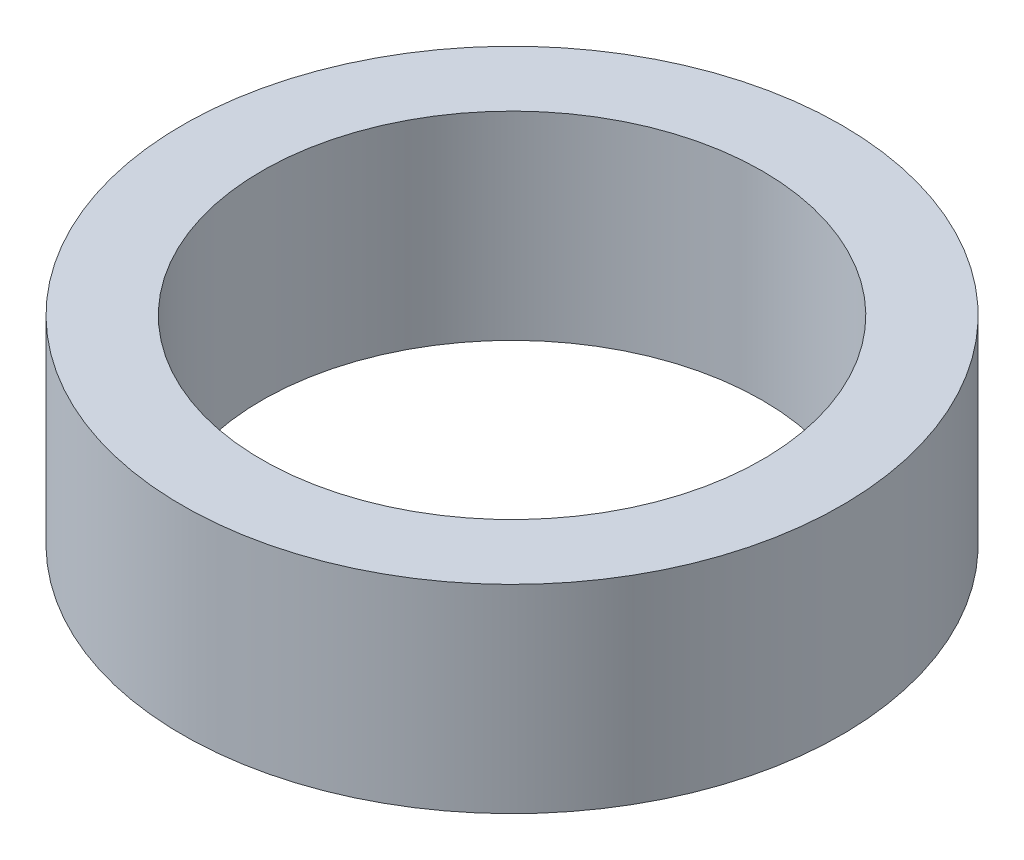
ISO-10303-21;
HEADER;
FILE_DESCRIPTION(('STEP AP214'),'2;1');
FILE_NAME('part.step','',(''),(''),'','','');
FILE_SCHEMA(('AUTOMOTIVE_DESIGN { 1 0 10303 214 1 1 1 1 }'));
ENDSEC;
DATA;
#1=APPLICATION_CONTEXT('core data for automotive mechanical design processes');
#2=APPLICATION_PROTOCOL_DEFINITION('international standard','automotive_design',2000,#1);
#3=PRODUCT_CONTEXT('',#1,'mechanical');
#4=PRODUCT('Part','Part','',(#3));
#5=PRODUCT_RELATED_PRODUCT_CATEGORY('part','',(#4));
#6=PRODUCT_DEFINITION_FORMATION('','',#4);
#7=PRODUCT_DEFINITION_CONTEXT('part definition',#1,'design');
#8=PRODUCT_DEFINITION('design','',#6,#7);
#9=PRODUCT_DEFINITION_SHAPE('','',#8);
#10=(LENGTH_UNIT() NAMED_UNIT(*) SI_UNIT(.MILLI.,.METRE.));
#11=(NAMED_UNIT(*) PLANE_ANGLE_UNIT() SI_UNIT($,.RADIAN.));
#12=(NAMED_UNIT(*) SI_UNIT($,.STERADIAN.) SOLID_ANGLE_UNIT());
#13=UNCERTAINTY_MEASURE_WITH_UNIT(LENGTH_MEASURE(1.E-05),#10,'distance_accuracy_value','');
#14=(GEOMETRIC_REPRESENTATION_CONTEXT(3) GLOBAL_UNCERTAINTY_ASSIGNED_CONTEXT((#13)) GLOBAL_UNIT_ASSIGNED_CONTEXT((#10,
#11,#12)) REPRESENTATION_CONTEXT('',''));
#15=CARTESIAN_POINT('',(0.,0.,0.));
#16=DIRECTION('',(0.,0.,1.));
#17=DIRECTION('',(1.,0.,0.));
#18=AXIS2_PLACEMENT_3D('',#15,#16,#17);
#19=CARTESIAN_POINT('',(0.,3.175,0.));
#20=DIRECTION('',(0.,1.,0.));
#21=DIRECTION('',(0.,0.,-1.));
#22=AXIS2_PLACEMENT_3D('',#19,#20,#21);
#23=PLANE('',#22);
#24=CARTESIAN_POINT('',(0.,3.175,0.));
#25=DIRECTION('',(0.,-1.,0.));
#26=DIRECTION('',(0.,0.,-1.));
#27=AXIS2_PLACEMENT_3D('',#24,#25,#26);
#28=CIRCLE('',#27,5.27);
#29=CARTESIAN_POINT('',(0.,3.175,-5.27));
#30=VERTEX_POINT('',#29);
#31=EDGE_CURVE('E10',#30,#30,#28,.T.);
#32=ORIENTED_EDGE('',*,*,#31,.F.);
#33=EDGE_LOOP('',(#32));
#34=FACE_BOUND('',#33,.T.);
#35=CARTESIAN_POINT('',(0.,3.175,0.));
#36=DIRECTION('',(0.,-1.,0.));
#37=DIRECTION('',(0.,0.,-1.));
#38=AXIS2_PLACEMENT_3D('',#35,#36,#37);
#39=CIRCLE('',#38,4.);
#40=CARTESIAN_POINT('',(0.,3.175,-4.));
#41=VERTEX_POINT('',#40);
#42=EDGE_CURVE('E50',#41,#41,#39,.T.);
#43=ORIENTED_EDGE('',*,*,#42,.T.);
#44=EDGE_LOOP('',(#43));
#45=FACE_BOUND('',#44,.T.);
#46=ADVANCED_FACE('F39',(#34,#45),#23,.T.);
#47=CARTESIAN_POINT('',(0.,0.,0.));
#48=DIRECTION('',(0.,1.,0.));
#49=DIRECTION('',(0.,0.,-1.));
#50=AXIS2_PLACEMENT_3D('',#47,#48,#49);
#51=PLANE('',#50);
#52=CARTESIAN_POINT('',(0.,0.,0.));
#53=DIRECTION('',(0.,-1.,0.));
#54=DIRECTION('',(0.,0.,-1.));
#55=AXIS2_PLACEMENT_3D('',#52,#53,#54);
#56=CIRCLE('',#55,5.27);
#57=CARTESIAN_POINT('',(0.,0.,-5.27));
#58=VERTEX_POINT('',#57);
#59=EDGE_CURVE('E43',#58,#58,#56,.T.);
#60=ORIENTED_EDGE('',*,*,#59,.T.);
#61=EDGE_LOOP('',(#60));
#62=FACE_BOUND('',#61,.T.);
#63=CARTESIAN_POINT('',(0.,0.,0.));
#64=DIRECTION('',(0.,-1.,0.));
#65=DIRECTION('',(0.,0.,-1.));
#66=AXIS2_PLACEMENT_3D('',#63,#64,#65);
#67=CIRCLE('',#66,4.);
#68=CARTESIAN_POINT('',(0.,0.,-4.));
#69=VERTEX_POINT('',#68);
#70=EDGE_CURVE('E52',#69,#69,#67,.T.);
#71=ORIENTED_EDGE('',*,*,#70,.F.);
#72=EDGE_LOOP('',(#71));
#73=FACE_BOUND('',#72,.T.);
#74=ADVANCED_FACE('F65',(#62,#73),#51,.F.);
#75=CARTESIAN_POINT('',(0.,3.175,0.));
#76=DIRECTION('',(0.,-1.,0.));
#77=DIRECTION('',(0.,0.,1.));
#78=AXIS2_PLACEMENT_3D('',#75,#76,#77);
#79=CYLINDRICAL_SURFACE('',#78,5.27);
#80=ORIENTED_EDGE('',*,*,#31,.T.);
#81=EDGE_LOOP('',(#80));
#82=FACE_BOUND('',#81,.T.);
#83=ORIENTED_EDGE('',*,*,#59,.F.);
#84=EDGE_LOOP('',(#83));
#85=FACE_BOUND('',#84,.T.);
#86=ADVANCED_FACE('F41',(#82,#85),#79,.T.);
#87=CARTESIAN_POINT('',(0.,3.175,0.));
#88=DIRECTION('',(0.,-1.,0.));
#89=DIRECTION('',(0.,0.,1.));
#90=AXIS2_PLACEMENT_3D('',#87,#88,#89);
#91=CYLINDRICAL_SURFACE('',#90,4.);
#92=ORIENTED_EDGE('',*,*,#42,.F.);
#93=EDGE_LOOP('',(#92));
#94=FACE_BOUND('',#93,.T.);
#95=ORIENTED_EDGE('',*,*,#70,.T.);
#96=EDGE_LOOP('',(#95));
#97=FACE_BOUND('',#96,.T.);
#98=ADVANCED_FACE('F59',(#94,#97),#91,.F.);
#99=CLOSED_SHELL('',(#46,#74,#86,#98));
#100=MANIFOLD_SOLID_BREP('B2',#99);
#101=ADVANCED_BREP_SHAPE_REPRESENTATION('',(#18,#100),#14);
#102=SHAPE_DEFINITION_REPRESENTATION(#9,#101);
ENDSEC;
END-ISO-10303-21;
